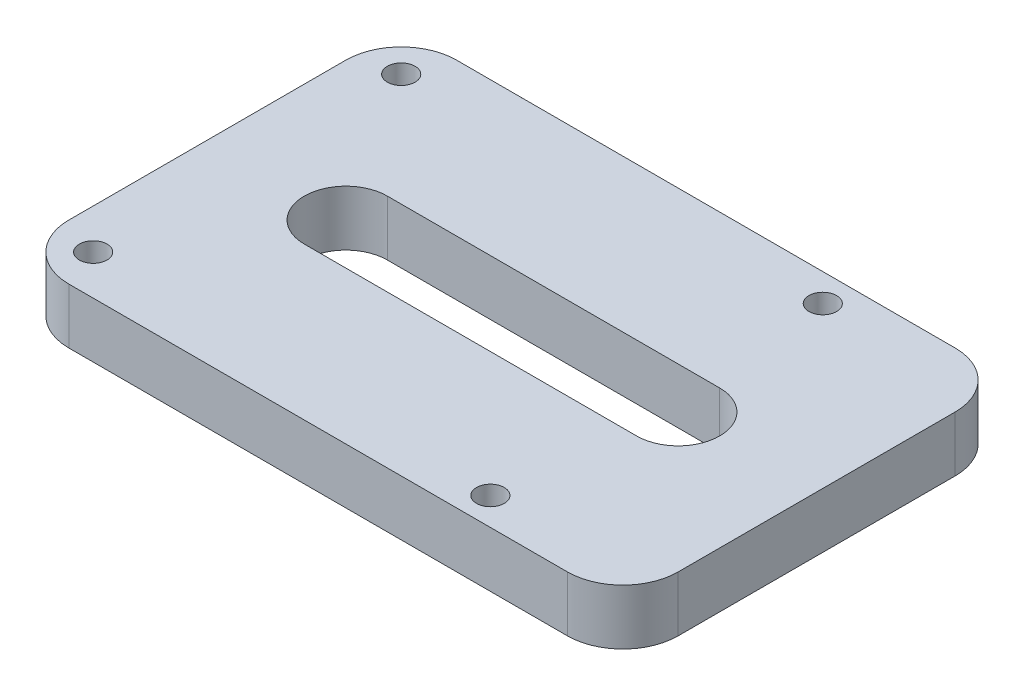
ISO-10303-21;
HEADER;
FILE_DESCRIPTION(('STEP AP214'),'2;1');
FILE_NAME('part.step','',(''),(''),'','','');
FILE_SCHEMA(('AUTOMOTIVE_DESIGN { 1 0 10303 214 1 1 1 1 }'));
ENDSEC;
DATA;
#1=APPLICATION_CONTEXT('core data for automotive mechanical design processes');
#2=APPLICATION_PROTOCOL_DEFINITION('international standard','automotive_design',2000,#1);
#3=PRODUCT_CONTEXT('',#1,'mechanical');
#4=PRODUCT('Part','Part','',(#3));
#5=PRODUCT_RELATED_PRODUCT_CATEGORY('part','',(#4));
#6=PRODUCT_DEFINITION_FORMATION('','',#4);
#7=PRODUCT_DEFINITION_CONTEXT('part definition',#1,'design');
#8=PRODUCT_DEFINITION('design','',#6,#7);
#9=PRODUCT_DEFINITION_SHAPE('','',#8);
#10=(LENGTH_UNIT() NAMED_UNIT(*) SI_UNIT(.MILLI.,.METRE.));
#11=(NAMED_UNIT(*) PLANE_ANGLE_UNIT() SI_UNIT($,.RADIAN.));
#12=(NAMED_UNIT(*) SI_UNIT($,.STERADIAN.) SOLID_ANGLE_UNIT());
#13=UNCERTAINTY_MEASURE_WITH_UNIT(LENGTH_MEASURE(1.E-05),#10,'distance_accuracy_value','');
#14=(GEOMETRIC_REPRESENTATION_CONTEXT(3) GLOBAL_UNCERTAINTY_ASSIGNED_CONTEXT((#13)) GLOBAL_UNIT_ASSIGNED_CONTEXT((#10,
#11,#12)) REPRESENTATION_CONTEXT('',''));
#15=CARTESIAN_POINT('',(0.,0.,0.));
#16=DIRECTION('',(0.,0.,1.));
#17=DIRECTION('',(1.,0.,0.));
#18=AXIS2_PLACEMENT_3D('',#15,#16,#17);
#19=CARTESIAN_POINT('',(-45.,10.,25.));
#20=DIRECTION('',(0.,-1.,0.));
#21=DIRECTION('',(0.,0.,-1.));
#22=AXIS2_PLACEMENT_3D('',#19,#20,#21);
#23=PLANE('',#22);
#24=CARTESIAN_POINT('',(26.1,10.,-30.));
#25=DIRECTION('',(0.,1.,0.));
#26=DIRECTION('',(0.,0.,1.));
#27=AXIS2_PLACEMENT_3D('',#24,#25,#26);
#28=CIRCLE('',#27,2.5);
#29=CARTESIAN_POINT('',(26.1,10.,-27.5));
#30=VERTEX_POINT('',#29);
#31=EDGE_CURVE('E179',#30,#30,#28,.T.);
#32=ORIENTED_EDGE('',*,*,#31,.F.);
#33=EDGE_LOOP('',(#32));
#34=FACE_BOUND('',#33,.T.);
#35=CARTESIAN_POINT('',(26.1,10.,30.));
#36=DIRECTION('',(0.,1.,0.));
#37=DIRECTION('',(0.,0.,-1.));
#38=AXIS2_PLACEMENT_3D('',#35,#36,#37);
#39=CIRCLE('',#38,2.5);
#40=CARTESIAN_POINT('',(26.1,10.,27.5));
#41=VERTEX_POINT('',#40);
#42=EDGE_CURVE('E187',#41,#41,#39,.T.);
#43=ORIENTED_EDGE('',*,*,#42,.F.);
#44=EDGE_LOOP('',(#43));
#45=FACE_BOUND('',#44,.T.);
#46=CARTESIAN_POINT('',(-47.8,10.,27.8));
#47=DIRECTION('',(0.,1.,0.));
#48=DIRECTION('',(0.,0.,-1.));
#49=AXIS2_PLACEMENT_3D('',#46,#47,#48);
#50=CIRCLE('',#49,2.5);
#51=CARTESIAN_POINT('',(-47.8,10.,25.3));
#52=VERTEX_POINT('',#51);
#53=EDGE_CURVE('E195',#52,#52,#50,.T.);
#54=ORIENTED_EDGE('',*,*,#53,.F.);
#55=EDGE_LOOP('',(#54));
#56=FACE_BOUND('',#55,.T.);
#57=CARTESIAN_POINT('',(-47.8,10.,-27.8));
#58=DIRECTION('',(0.,1.,0.));
#59=DIRECTION('',(0.,0.,1.));
#60=AXIS2_PLACEMENT_3D('',#57,#58,#59);
#61=CIRCLE('',#60,2.5);
#62=CARTESIAN_POINT('',(-47.8,10.,-25.3));
#63=VERTEX_POINT('',#62);
#64=EDGE_CURVE('E203',#63,#63,#61,.T.);
#65=ORIENTED_EDGE('',*,*,#64,.F.);
#66=EDGE_LOOP('',(#65));
#67=FACE_BOUND('',#66,.T.);
#68=CARTESIAN_POINT('',(-45.,10.,25.));
#69=DIRECTION('',(0.,1.,0.));
#70=DIRECTION('',(0.,0.,-1.));
#71=AXIS2_PLACEMENT_3D('',#68,#69,#70);
#72=CIRCLE('',#71,10.);
#73=CARTESIAN_POINT('',(-55.,10.,25.));
#74=VERTEX_POINT('',#73);
#75=CARTESIAN_POINT('',(-45.,10.,35.));
#76=VERTEX_POINT('',#75);
#77=EDGE_CURVE('E211',#74,#76,#72,.T.);
#78=ORIENTED_EDGE('',*,*,#77,.T.);
#79=DIRECTION('',(1.,0.,0.));
#80=VECTOR('',#79,1.);
#81=CARTESIAN_POINT('',(-45.,10.,35.));
#82=LINE('',#81,#80);
#83=CARTESIAN_POINT('',(45.,10.,35.));
#84=VERTEX_POINT('',#83);
#85=EDGE_CURVE('E215',#76,#84,#82,.T.);
#86=ORIENTED_EDGE('',*,*,#85,.T.);
#87=CARTESIAN_POINT('',(45.,10.,25.));
#88=DIRECTION('',(0.,1.,0.));
#89=DIRECTION('',(0.,0.,1.));
#90=AXIS2_PLACEMENT_3D('',#87,#88,#89);
#91=CIRCLE('',#90,10.);
#92=CARTESIAN_POINT('',(55.,10.,25.));
#93=VERTEX_POINT('',#92);
#94=EDGE_CURVE('E219',#84,#93,#91,.T.);
#95=ORIENTED_EDGE('',*,*,#94,.T.);
#96=DIRECTION('',(0.,0.,-1.));
#97=VECTOR('',#96,1.);
#98=CARTESIAN_POINT('',(55.,10.,25.));
#99=LINE('',#98,#97);
#100=CARTESIAN_POINT('',(55.,10.,-25.));
#101=VERTEX_POINT('',#100);
#102=EDGE_CURVE('E222',#93,#101,#99,.T.);
#103=ORIENTED_EDGE('',*,*,#102,.T.);
#104=CARTESIAN_POINT('',(45.,10.,-25.));
#105=DIRECTION('',(0.,1.,0.));
#106=DIRECTION('',(0.,0.,-1.));
#107=AXIS2_PLACEMENT_3D('',#104,#105,#106);
#108=CIRCLE('',#107,10.);
#109=CARTESIAN_POINT('',(45.,10.,-35.));
#110=VERTEX_POINT('',#109);
#111=EDGE_CURVE('E225',#101,#110,#108,.T.);
#112=ORIENTED_EDGE('',*,*,#111,.T.);
#113=DIRECTION('',(-1.,0.,0.));
#114=VECTOR('',#113,1.);
#115=CARTESIAN_POINT('',(-45.,10.,-35.));
#116=LINE('',#115,#114);
#117=CARTESIAN_POINT('',(-45.,10.,-35.));
#118=VERTEX_POINT('',#117);
#119=EDGE_CURVE('E228',#110,#118,#116,.T.);
#120=ORIENTED_EDGE('',*,*,#119,.T.);
#121=CARTESIAN_POINT('',(-45.,10.,-25.));
#122=DIRECTION('',(0.,1.,0.));
#123=DIRECTION('',(0.,0.,-1.));
#124=AXIS2_PLACEMENT_3D('',#121,#122,#123);
#125=CIRCLE('',#124,10.);
#126=CARTESIAN_POINT('',(-55.,10.,-25.));
#127=VERTEX_POINT('',#126);
#128=EDGE_CURVE('E231',#118,#127,#125,.T.);
#129=ORIENTED_EDGE('',*,*,#128,.T.);
#130=DIRECTION('',(0.,0.,1.));
#131=VECTOR('',#130,1.);
#132=CARTESIAN_POINT('',(-55.,10.,25.));
#133=LINE('',#132,#131);
#134=EDGE_CURVE('E234',#127,#74,#133,.T.);
#135=ORIENTED_EDGE('',*,*,#134,.T.);
#136=EDGE_LOOP('',(#78,#86,#95,#103,#112,#120,#129,#135));
#137=FACE_BOUND('',#136,.T.);
#138=CARTESIAN_POINT('',(-30.,10.,0.));
#139=DIRECTION('',(0.,1.,0.));
#140=DIRECTION('',(0.,0.,1.));
#141=AXIS2_PLACEMENT_3D('',#138,#139,#140);
#142=CIRCLE('',#141,7.49999999999999);
#143=CARTESIAN_POINT('',(-30.,10.,-7.49999999999999));
#144=VERTEX_POINT('',#143);
#145=CARTESIAN_POINT('',(-30.,10.,7.49999999999999));
#146=VERTEX_POINT('',#145);
#147=EDGE_CURVE('E131',#144,#146,#142,.T.);
#148=ORIENTED_EDGE('',*,*,#147,.F.);
#149=DIRECTION('',(-1.,0.,0.));
#150=VECTOR('',#149,1.);
#151=CARTESIAN_POINT('',(-30.,10.,-7.49999999999999));
#152=LINE('',#151,#150);
#153=CARTESIAN_POINT('',(30.,10.,-7.49999999999999));
#154=VERTEX_POINT('',#153);
#155=EDGE_CURVE('E157',#154,#144,#152,.T.);
#156=ORIENTED_EDGE('',*,*,#155,.F.);
#157=CARTESIAN_POINT('',(30.,10.,0.));
#158=DIRECTION('',(0.,1.,0.));
#159=DIRECTION('',(0.,0.,1.));
#160=AXIS2_PLACEMENT_3D('',#157,#158,#159);
#161=CIRCLE('',#160,7.49999999999999);
#162=CARTESIAN_POINT('',(30.,10.,7.49999999999999));
#163=VERTEX_POINT('',#162);
#164=EDGE_CURVE('E153',#163,#154,#161,.T.);
#165=ORIENTED_EDGE('',*,*,#164,.F.);
#166=DIRECTION('',(1.,0.,0.));
#167=VECTOR('',#166,1.);
#168=CARTESIAN_POINT('',(-30.,10.,7.49999999999999));
#169=LINE('',#168,#167);
#170=EDGE_CURVE('E140',#146,#163,#169,.T.);
#171=ORIENTED_EDGE('',*,*,#170,.F.);
#172=EDGE_LOOP('',(#148,#156,#165,#171));
#173=FACE_BOUND('',#172,.T.);
#174=ADVANCED_FACE('F41',(#34,#45,#56,#67,#137,#173),#23,.F.);
#175=CARTESIAN_POINT('',(-45.,0.,25.));
#176=DIRECTION('',(0.,-1.,0.));
#177=DIRECTION('',(0.,0.,-1.));
#178=AXIS2_PLACEMENT_3D('',#175,#176,#177);
#179=PLANE('',#178);
#180=CARTESIAN_POINT('',(26.1,0.,30.));
#181=DIRECTION('',(0.,1.,0.));
#182=DIRECTION('',(0.,0.,-1.));
#183=AXIS2_PLACEMENT_3D('',#180,#181,#182);
#184=CIRCLE('',#183,2.5);
#185=CARTESIAN_POINT('',(26.1,0.,27.5));
#186=VERTEX_POINT('',#185);
#187=EDGE_CURVE('E183',#186,#186,#184,.T.);
#188=ORIENTED_EDGE('',*,*,#187,.T.);
#189=EDGE_LOOP('',(#188));
#190=FACE_BOUND('',#189,.T.);
#191=CARTESIAN_POINT('',(-47.8,0.,-27.8));
#192=DIRECTION('',(0.,1.,0.));
#193=DIRECTION('',(0.,0.,1.));
#194=AXIS2_PLACEMENT_3D('',#191,#192,#193);
#195=CIRCLE('',#194,2.5);
#196=CARTESIAN_POINT('',(-47.8,0.,-25.3));
#197=VERTEX_POINT('',#196);
#198=EDGE_CURVE('E199',#197,#197,#195,.T.);
#199=ORIENTED_EDGE('',*,*,#198,.T.);
#200=EDGE_LOOP('',(#199));
#201=FACE_BOUND('',#200,.T.);
#202=CARTESIAN_POINT('',(-45.,0.,25.));
#203=DIRECTION('',(0.,1.,0.));
#204=DIRECTION('',(0.,0.,-1.));
#205=AXIS2_PLACEMENT_3D('',#202,#203,#204);
#206=CIRCLE('',#205,10.);
#207=CARTESIAN_POINT('',(-55.,0.,25.));
#208=VERTEX_POINT('',#207);
#209=CARTESIAN_POINT('',(-45.,0.,35.));
#210=VERTEX_POINT('',#209);
#211=EDGE_CURVE('E207',#208,#210,#206,.T.);
#212=ORIENTED_EDGE('',*,*,#211,.F.);
#213=DIRECTION('',(0.,0.,1.));
#214=VECTOR('',#213,1.);
#215=CARTESIAN_POINT('',(-55.,0.,25.));
#216=LINE('',#215,#214);
#217=CARTESIAN_POINT('',(-55.,0.,-25.));
#218=VERTEX_POINT('',#217);
#219=EDGE_CURVE('E216',#218,#208,#216,.T.);
#220=ORIENTED_EDGE('',*,*,#219,.F.);
#221=CARTESIAN_POINT('',(-45.,0.,-25.));
#222=DIRECTION('',(0.,1.,0.));
#223=DIRECTION('',(0.,0.,-1.));
#224=AXIS2_PLACEMENT_3D('',#221,#222,#223);
#225=CIRCLE('',#224,10.);
#226=CARTESIAN_POINT('',(-45.,0.,-35.));
#227=VERTEX_POINT('',#226);
#228=EDGE_CURVE('E256',#227,#218,#225,.T.);
#229=ORIENTED_EDGE('',*,*,#228,.F.);
#230=DIRECTION('',(-1.,0.,0.));
#231=VECTOR('',#230,1.);
#232=CARTESIAN_POINT('',(-45.,0.,-35.));
#233=LINE('',#232,#231);
#234=CARTESIAN_POINT('',(45.,0.,-35.));
#235=VERTEX_POINT('',#234);
#236=EDGE_CURVE('E253',#235,#227,#233,.T.);
#237=ORIENTED_EDGE('',*,*,#236,.F.);
#238=CARTESIAN_POINT('',(45.,0.,-25.));
#239=DIRECTION('',(0.,1.,0.));
#240=DIRECTION('',(0.,0.,-1.));
#241=AXIS2_PLACEMENT_3D('',#238,#239,#240);
#242=CIRCLE('',#241,10.);
#243=CARTESIAN_POINT('',(55.,0.,-25.));
#244=VERTEX_POINT('',#243);
#245=EDGE_CURVE('E250',#244,#235,#242,.T.);
#246=ORIENTED_EDGE('',*,*,#245,.F.);
#247=DIRECTION('',(0.,0.,-1.));
#248=VECTOR('',#247,1.);
#249=CARTESIAN_POINT('',(55.,0.,25.));
#250=LINE('',#249,#248);
#251=CARTESIAN_POINT('',(55.,0.,25.));
#252=VERTEX_POINT('',#251);
#253=EDGE_CURVE('E247',#252,#244,#250,.T.);
#254=ORIENTED_EDGE('',*,*,#253,.F.);
#255=CARTESIAN_POINT('',(45.,0.,25.));
#256=DIRECTION('',(0.,1.,0.));
#257=DIRECTION('',(0.,0.,1.));
#258=AXIS2_PLACEMENT_3D('',#255,#256,#257);
#259=CIRCLE('',#258,10.);
#260=CARTESIAN_POINT('',(45.,0.,35.));
#261=VERTEX_POINT('',#260);
#262=EDGE_CURVE('E244',#261,#252,#259,.T.);
#263=ORIENTED_EDGE('',*,*,#262,.F.);
#264=DIRECTION('',(1.,0.,0.));
#265=VECTOR('',#264,1.);
#266=CARTESIAN_POINT('',(-45.,0.,35.));
#267=LINE('',#266,#265);
#268=EDGE_CURVE('E241',#210,#261,#267,.T.);
#269=ORIENTED_EDGE('',*,*,#268,.F.);
#270=EDGE_LOOP('',(#212,#220,#229,#237,#246,#254,#263,#269));
#271=FACE_BOUND('',#270,.T.);
#272=CARTESIAN_POINT('',(-47.8,0.,27.8));
#273=DIRECTION('',(0.,1.,0.));
#274=DIRECTION('',(0.,0.,-1.));
#275=AXIS2_PLACEMENT_3D('',#272,#273,#274);
#276=CIRCLE('',#275,2.5);
#277=CARTESIAN_POINT('',(-47.8,0.,25.3));
#278=VERTEX_POINT('',#277);
#279=EDGE_CURVE('E191',#278,#278,#276,.T.);
#280=ORIENTED_EDGE('',*,*,#279,.T.);
#281=EDGE_LOOP('',(#280));
#282=FACE_BOUND('',#281,.T.);
#283=CARTESIAN_POINT('',(26.1,0.,-30.));
#284=DIRECTION('',(0.,1.,0.));
#285=DIRECTION('',(0.,0.,1.));
#286=AXIS2_PLACEMENT_3D('',#283,#284,#285);
#287=CIRCLE('',#286,2.5);
#288=CARTESIAN_POINT('',(26.1,0.,-27.5));
#289=VERTEX_POINT('',#288);
#290=EDGE_CURVE('E149',#289,#289,#287,.T.);
#291=ORIENTED_EDGE('',*,*,#290,.T.);
#292=EDGE_LOOP('',(#291));
#293=FACE_BOUND('',#292,.T.);
#294=DIRECTION('',(-1.,0.,0.));
#295=VECTOR('',#294,1.);
#296=CARTESIAN_POINT('',(-30.,0.,-7.49999999999999));
#297=LINE('',#296,#295);
#298=CARTESIAN_POINT('',(30.,0.,-7.49999999999999));
#299=VERTEX_POINT('',#298);
#300=CARTESIAN_POINT('',(-30.,0.,-7.49999999999999));
#301=VERTEX_POINT('',#300);
#302=EDGE_CURVE('E141',#299,#301,#297,.T.);
#303=ORIENTED_EDGE('',*,*,#302,.T.);
#304=CARTESIAN_POINT('',(-30.,0.,0.));
#305=DIRECTION('',(0.,1.,0.));
#306=DIRECTION('',(0.,0.,1.));
#307=AXIS2_PLACEMENT_3D('',#304,#305,#306);
#308=CIRCLE('',#307,7.49999999999999);
#309=CARTESIAN_POINT('',(-30.,0.,7.49999999999999));
#310=VERTEX_POINT('',#309);
#311=EDGE_CURVE('E65',#301,#310,#308,.T.);
#312=ORIENTED_EDGE('',*,*,#311,.T.);
#313=DIRECTION('',(1.,0.,0.));
#314=VECTOR('',#313,1.);
#315=CARTESIAN_POINT('',(-30.,0.,7.49999999999999));
#316=LINE('',#315,#314);
#317=CARTESIAN_POINT('',(30.,0.,7.49999999999999));
#318=VERTEX_POINT('',#317);
#319=EDGE_CURVE('E147',#310,#318,#316,.T.);
#320=ORIENTED_EDGE('',*,*,#319,.T.);
#321=CARTESIAN_POINT('',(30.,0.,0.));
#322=DIRECTION('',(0.,1.,0.));
#323=DIRECTION('',(0.,0.,1.));
#324=AXIS2_PLACEMENT_3D('',#321,#322,#323);
#325=CIRCLE('',#324,7.49999999999999);
#326=EDGE_CURVE('E166',#318,#299,#325,.T.);
#327=ORIENTED_EDGE('',*,*,#326,.T.);
#328=EDGE_LOOP('',(#303,#312,#320,#327));
#329=FACE_BOUND('',#328,.T.);
#330=ADVANCED_FACE('F295',(#190,#201,#271,#282,#293,#329),#179,.T.);
#331=CARTESIAN_POINT('',(-45.,10.,25.));
#332=DIRECTION('',(0.,-1.,0.));
#333=DIRECTION('',(0.,0.,-1.));
#334=AXIS2_PLACEMENT_3D('',#331,#332,#333);
#335=CYLINDRICAL_SURFACE('',#334,10.);
#336=ORIENTED_EDGE('',*,*,#211,.T.);
#337=DIRECTION('',(0.,-1.,0.));
#338=VECTOR('',#337,1.);
#339=CARTESIAN_POINT('',(-45.,10.,35.));
#340=LINE('',#339,#338);
#341=EDGE_CURVE('E11',#76,#210,#340,.T.);
#342=ORIENTED_EDGE('',*,*,#341,.F.);
#343=ORIENTED_EDGE('',*,*,#77,.F.);
#344=DIRECTION('',(0.,-1.,0.));
#345=VECTOR('',#344,1.);
#346=CARTESIAN_POINT('',(-55.,10.,25.));
#347=LINE('',#346,#345);
#348=EDGE_CURVE('E237',#74,#208,#347,.T.);
#349=ORIENTED_EDGE('',*,*,#348,.T.);
#350=EDGE_LOOP('',(#336,#342,#343,#349));
#351=FACE_BOUND('',#350,.T.);
#352=ADVANCED_FACE('F43',(#351),#335,.T.);
#353=CARTESIAN_POINT('',(-45.,10.,35.));
#354=DIRECTION('',(0.,0.,-1.));
#355=DIRECTION('',(-1.,0.,0.));
#356=AXIS2_PLACEMENT_3D('',#353,#354,#355);
#357=PLANE('',#356);
#358=ORIENTED_EDGE('',*,*,#268,.T.);
#359=DIRECTION('',(0.,-1.,0.));
#360=VECTOR('',#359,1.);
#361=CARTESIAN_POINT('',(45.,10.,35.));
#362=LINE('',#361,#360);
#363=EDGE_CURVE('E50',#84,#261,#362,.T.);
#364=ORIENTED_EDGE('',*,*,#363,.F.);
#365=ORIENTED_EDGE('',*,*,#85,.F.);
#366=ORIENTED_EDGE('',*,*,#341,.T.);
#367=EDGE_LOOP('',(#358,#364,#365,#366));
#368=FACE_BOUND('',#367,.T.);
#369=ADVANCED_FACE('F312',(#368),#357,.F.);
#370=CARTESIAN_POINT('',(45.,10.,25.));
#371=DIRECTION('',(0.,-1.,0.));
#372=DIRECTION('',(0.,0.,-1.));
#373=AXIS2_PLACEMENT_3D('',#370,#371,#372);
#374=CYLINDRICAL_SURFACE('',#373,10.);
#375=ORIENTED_EDGE('',*,*,#262,.T.);
#376=DIRECTION('',(0.,-1.,0.));
#377=VECTOR('',#376,1.);
#378=CARTESIAN_POINT('',(55.,10.,25.));
#379=LINE('',#378,#377);
#380=EDGE_CURVE('E280',#93,#252,#379,.T.);
#381=ORIENTED_EDGE('',*,*,#380,.F.);
#382=ORIENTED_EDGE('',*,*,#94,.F.);
#383=ORIENTED_EDGE('',*,*,#363,.T.);
#384=EDGE_LOOP('',(#375,#381,#382,#383));
#385=FACE_BOUND('',#384,.T.);
#386=ADVANCED_FACE('F289',(#385),#374,.T.);
#387=CARTESIAN_POINT('',(55.,10.,25.));
#388=DIRECTION('',(-1.,0.,0.));
#389=DIRECTION('',(0.,0.,1.));
#390=AXIS2_PLACEMENT_3D('',#387,#388,#389);
#391=PLANE('',#390);
#392=ORIENTED_EDGE('',*,*,#253,.T.);
#393=DIRECTION('',(0.,-1.,0.));
#394=VECTOR('',#393,1.);
#395=CARTESIAN_POINT('',(55.,10.,-25.));
#396=LINE('',#395,#394);
#397=EDGE_CURVE('E276',#101,#244,#396,.T.);
#398=ORIENTED_EDGE('',*,*,#397,.F.);
#399=ORIENTED_EDGE('',*,*,#102,.F.);
#400=ORIENTED_EDGE('',*,*,#380,.T.);
#401=EDGE_LOOP('',(#392,#398,#399,#400));
#402=FACE_BOUND('',#401,.T.);
#403=ADVANCED_FACE('F301',(#402),#391,.F.);
#404=CARTESIAN_POINT('',(45.,10.,-25.));
#405=DIRECTION('',(0.,-1.,0.));
#406=DIRECTION('',(0.,0.,-1.));
#407=AXIS2_PLACEMENT_3D('',#404,#405,#406);
#408=CYLINDRICAL_SURFACE('',#407,10.);
#409=ORIENTED_EDGE('',*,*,#245,.T.);
#410=DIRECTION('',(0.,-1.,0.));
#411=VECTOR('',#410,1.);
#412=CARTESIAN_POINT('',(45.,10.,-35.));
#413=LINE('',#412,#411);
#414=EDGE_CURVE('E272',#110,#235,#413,.T.);
#415=ORIENTED_EDGE('',*,*,#414,.F.);
#416=ORIENTED_EDGE('',*,*,#111,.F.);
#417=ORIENTED_EDGE('',*,*,#397,.T.);
#418=EDGE_LOOP('',(#409,#415,#416,#417));
#419=FACE_BOUND('',#418,.T.);
#420=ADVANCED_FACE('F305',(#419),#408,.T.);
#421=CARTESIAN_POINT('',(-45.,10.,-35.));
#422=DIRECTION('',(0.,0.,1.));
#423=DIRECTION('',(1.,0.,0.));
#424=AXIS2_PLACEMENT_3D('',#421,#422,#423);
#425=PLANE('',#424);
#426=ORIENTED_EDGE('',*,*,#236,.T.);
#427=DIRECTION('',(0.,-1.,0.));
#428=VECTOR('',#427,1.);
#429=CARTESIAN_POINT('',(-45.,10.,-35.));
#430=LINE('',#429,#428);
#431=EDGE_CURVE('E268',#118,#227,#430,.T.);
#432=ORIENTED_EDGE('',*,*,#431,.F.);
#433=ORIENTED_EDGE('',*,*,#119,.F.);
#434=ORIENTED_EDGE('',*,*,#414,.T.);
#435=EDGE_LOOP('',(#426,#432,#433,#434));
#436=FACE_BOUND('',#435,.T.);
#437=ADVANCED_FACE('F325',(#436),#425,.F.);
#438=CARTESIAN_POINT('',(-45.,10.,-25.));
#439=DIRECTION('',(0.,-1.,0.));
#440=DIRECTION('',(0.,0.,-1.));
#441=AXIS2_PLACEMENT_3D('',#438,#439,#440);
#442=CYLINDRICAL_SURFACE('',#441,10.);
#443=ORIENTED_EDGE('',*,*,#228,.T.);
#444=DIRECTION('',(0.,-1.,0.));
#445=VECTOR('',#444,1.);
#446=CARTESIAN_POINT('',(-55.,10.,-25.));
#447=LINE('',#446,#445);
#448=EDGE_CURVE('E264',#127,#218,#447,.T.);
#449=ORIENTED_EDGE('',*,*,#448,.F.);
#450=ORIENTED_EDGE('',*,*,#128,.F.);
#451=ORIENTED_EDGE('',*,*,#431,.T.);
#452=EDGE_LOOP('',(#443,#449,#450,#451));
#453=FACE_BOUND('',#452,.T.);
#454=ADVANCED_FACE('F323',(#453),#442,.T.);
#455=CARTESIAN_POINT('',(-55.,10.,25.));
#456=DIRECTION('',(1.,0.,0.));
#457=DIRECTION('',(0.,0.,-1.));
#458=AXIS2_PLACEMENT_3D('',#455,#456,#457);
#459=PLANE('',#458);
#460=ORIENTED_EDGE('',*,*,#219,.T.);
#461=ORIENTED_EDGE('',*,*,#348,.F.);
#462=ORIENTED_EDGE('',*,*,#134,.F.);
#463=ORIENTED_EDGE('',*,*,#448,.T.);
#464=EDGE_LOOP('',(#460,#461,#462,#463));
#465=FACE_BOUND('',#464,.T.);
#466=ADVANCED_FACE('F318',(#465),#459,.F.);
#467=CARTESIAN_POINT('',(-47.8,10.,-27.8));
#468=DIRECTION('',(0.,-1.,0.));
#469=DIRECTION('',(0.,0.,-1.));
#470=AXIS2_PLACEMENT_3D('',#467,#468,#469);
#471=CYLINDRICAL_SURFACE('',#470,2.5);
#472=ORIENTED_EDGE('',*,*,#64,.T.);
#473=EDGE_LOOP('',(#472));
#474=FACE_BOUND('',#473,.T.);
#475=ORIENTED_EDGE('',*,*,#198,.F.);
#476=EDGE_LOOP('',(#475));
#477=FACE_BOUND('',#476,.T.);
#478=ADVANCED_FACE('F345',(#474,#477),#471,.F.);
#479=CARTESIAN_POINT('',(-47.8,10.,27.8));
#480=DIRECTION('',(0.,-1.,0.));
#481=DIRECTION('',(0.,0.,-1.));
#482=AXIS2_PLACEMENT_3D('',#479,#480,#481);
#483=CYLINDRICAL_SURFACE('',#482,2.5);
#484=ORIENTED_EDGE('',*,*,#53,.T.);
#485=EDGE_LOOP('',(#484));
#486=FACE_BOUND('',#485,.T.);
#487=ORIENTED_EDGE('',*,*,#279,.F.);
#488=EDGE_LOOP('',(#487));
#489=FACE_BOUND('',#488,.T.);
#490=ADVANCED_FACE('F352',(#486,#489),#483,.F.);
#491=CARTESIAN_POINT('',(26.1,10.,30.));
#492=DIRECTION('',(0.,-1.,0.));
#493=DIRECTION('',(0.,0.,-1.));
#494=AXIS2_PLACEMENT_3D('',#491,#492,#493);
#495=CYLINDRICAL_SURFACE('',#494,2.5);
#496=ORIENTED_EDGE('',*,*,#42,.T.);
#497=EDGE_LOOP('',(#496));
#498=FACE_BOUND('',#497,.T.);
#499=ORIENTED_EDGE('',*,*,#187,.F.);
#500=EDGE_LOOP('',(#499));
#501=FACE_BOUND('',#500,.T.);
#502=ADVANCED_FACE('F357',(#498,#501),#495,.F.);
#503=CARTESIAN_POINT('',(26.1,10.,-30.));
#504=DIRECTION('',(0.,-1.,0.));
#505=DIRECTION('',(0.,0.,-1.));
#506=AXIS2_PLACEMENT_3D('',#503,#504,#505);
#507=CYLINDRICAL_SURFACE('',#506,2.5);
#508=ORIENTED_EDGE('',*,*,#31,.T.);
#509=EDGE_LOOP('',(#508));
#510=FACE_BOUND('',#509,.T.);
#511=ORIENTED_EDGE('',*,*,#290,.F.);
#512=EDGE_LOOP('',(#511));
#513=FACE_BOUND('',#512,.T.);
#514=ADVANCED_FACE('F367',(#510,#513),#507,.F.);
#515=CARTESIAN_POINT('',(-30.,10.,0.));
#516=DIRECTION('',(0.,-1.,0.));
#517=DIRECTION('',(0.,0.,-1.));
#518=AXIS2_PLACEMENT_3D('',#515,#516,#517);
#519=CYLINDRICAL_SURFACE('',#518,7.49999999999999);
#520=ORIENTED_EDGE('',*,*,#311,.F.);
#521=DIRECTION('',(0.,-1.,0.));
#522=VECTOR('',#521,1.);
#523=CARTESIAN_POINT('',(-30.,10.,-7.49999999999999));
#524=LINE('',#523,#522);
#525=EDGE_CURVE('E135',#144,#301,#524,.T.);
#526=ORIENTED_EDGE('',*,*,#525,.F.);
#527=ORIENTED_EDGE('',*,*,#147,.T.);
#528=DIRECTION('',(0.,-1.,0.));
#529=VECTOR('',#528,1.);
#530=CARTESIAN_POINT('',(-30.,10.,7.49999999999999));
#531=LINE('',#530,#529);
#532=EDGE_CURVE('E134',#146,#310,#531,.T.);
#533=ORIENTED_EDGE('',*,*,#532,.T.);
#534=EDGE_LOOP('',(#520,#526,#527,#533));
#535=FACE_BOUND('',#534,.T.);
#536=ADVANCED_FACE('F133',(#535),#519,.F.);
#537=CARTESIAN_POINT('',(-30.,10.,7.49999999999999));
#538=DIRECTION('',(0.,0.,-1.));
#539=DIRECTION('',(-1.,0.,0.));
#540=AXIS2_PLACEMENT_3D('',#537,#538,#539);
#541=PLANE('',#540);
#542=ORIENTED_EDGE('',*,*,#319,.F.);
#543=ORIENTED_EDGE('',*,*,#532,.F.);
#544=ORIENTED_EDGE('',*,*,#170,.T.);
#545=DIRECTION('',(0.,-1.,0.));
#546=VECTOR('',#545,1.);
#547=CARTESIAN_POINT('',(30.,10.,7.49999999999999));
#548=LINE('',#547,#546);
#549=EDGE_CURVE('E150',#163,#318,#548,.T.);
#550=ORIENTED_EDGE('',*,*,#549,.T.);
#551=EDGE_LOOP('',(#542,#543,#544,#550));
#552=FACE_BOUND('',#551,.T.);
#553=ADVANCED_FACE('F144',(#552),#541,.T.);
#554=CARTESIAN_POINT('',(30.,10.,0.));
#555=DIRECTION('',(0.,-1.,0.));
#556=DIRECTION('',(0.,0.,-1.));
#557=AXIS2_PLACEMENT_3D('',#554,#555,#556);
#558=CYLINDRICAL_SURFACE('',#557,7.49999999999999);
#559=ORIENTED_EDGE('',*,*,#326,.F.);
#560=ORIENTED_EDGE('',*,*,#549,.F.);
#561=ORIENTED_EDGE('',*,*,#164,.T.);
#562=DIRECTION('',(0.,-1.,0.));
#563=VECTOR('',#562,1.);
#564=CARTESIAN_POINT('',(30.,10.,-7.49999999999999));
#565=LINE('',#564,#563);
#566=EDGE_CURVE('E57',#154,#299,#565,.T.);
#567=ORIENTED_EDGE('',*,*,#566,.T.);
#568=EDGE_LOOP('',(#559,#560,#561,#567));
#569=FACE_BOUND('',#568,.T.);
#570=ADVANCED_FACE('F379',(#569),#558,.F.);
#571=CARTESIAN_POINT('',(-30.,10.,-7.49999999999999));
#572=DIRECTION('',(0.,0.,1.));
#573=DIRECTION('',(1.,0.,0.));
#574=AXIS2_PLACEMENT_3D('',#571,#572,#573);
#575=PLANE('',#574);
#576=ORIENTED_EDGE('',*,*,#302,.F.);
#577=ORIENTED_EDGE('',*,*,#566,.F.);
#578=ORIENTED_EDGE('',*,*,#155,.T.);
#579=ORIENTED_EDGE('',*,*,#525,.T.);
#580=EDGE_LOOP('',(#576,#577,#578,#579));
#581=FACE_BOUND('',#580,.T.);
#582=ADVANCED_FACE('F382',(#581),#575,.T.);
#583=CLOSED_SHELL('',(#174,#330,#352,#369,#386,#403,#420,#437,#454,#466,#478,#490,#502,#514,
#536,#553,#570,#582));
#584=MANIFOLD_SOLID_BREP('B2',#583);
#585=ADVANCED_BREP_SHAPE_REPRESENTATION('',(#18,#584),#14);
#586=SHAPE_DEFINITION_REPRESENTATION(#9,#585);
ENDSEC;
END-ISO-10303-21;
